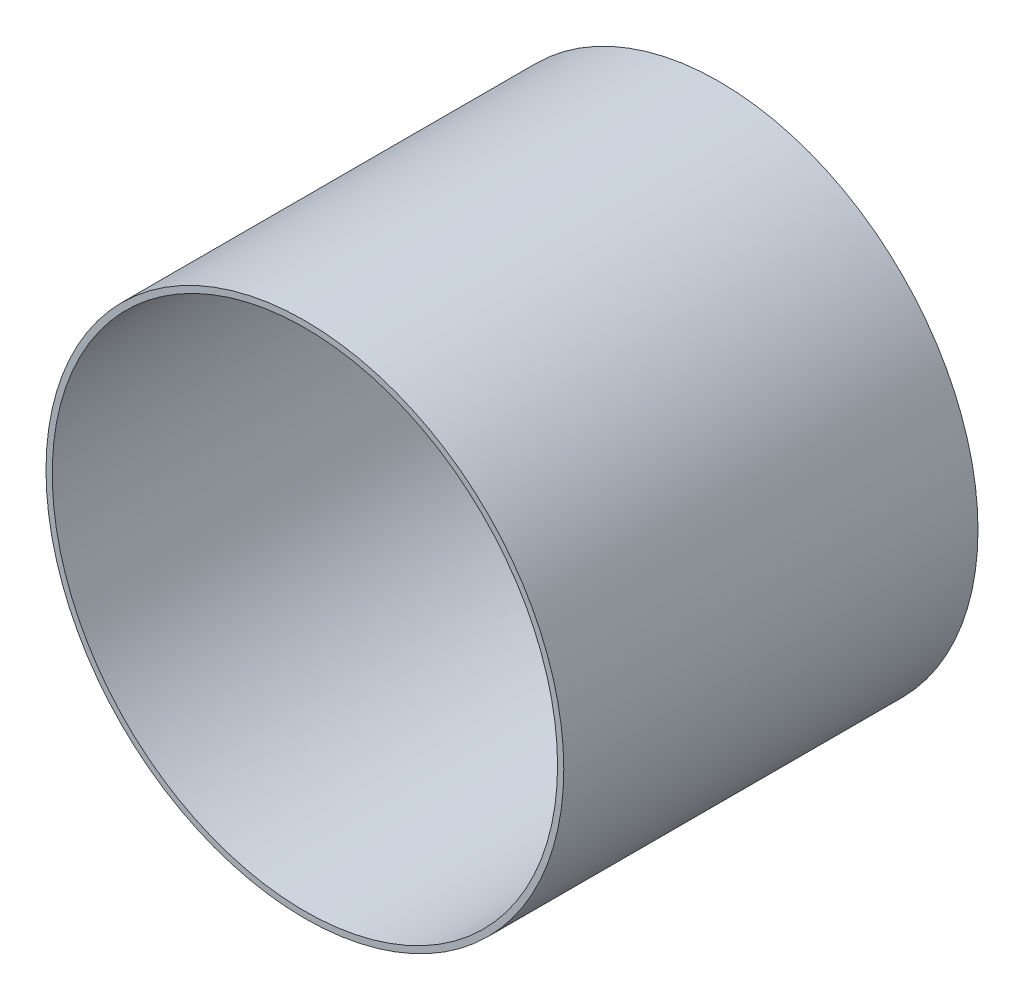
ISO-10303-21;
HEADER;
FILE_DESCRIPTION(('STEP AP214'),'2;1');
FILE_NAME('part.step','',(''),(''),'','','');
FILE_SCHEMA(('AUTOMOTIVE_DESIGN { 1 0 10303 214 1 1 1 1 }'));
ENDSEC;
DATA;
#1=APPLICATION_CONTEXT('core data for automotive mechanical design processes');
#2=APPLICATION_PROTOCOL_DEFINITION('international standard','automotive_design',2000,#1);
#3=PRODUCT_CONTEXT('',#1,'mechanical');
#4=PRODUCT('Part','Part','',(#3));
#5=PRODUCT_RELATED_PRODUCT_CATEGORY('part','',(#4));
#6=PRODUCT_DEFINITION_FORMATION('','',#4);
#7=PRODUCT_DEFINITION_CONTEXT('part definition',#1,'design');
#8=PRODUCT_DEFINITION('design','',#6,#7);
#9=PRODUCT_DEFINITION_SHAPE('','',#8);
#10=(LENGTH_UNIT() NAMED_UNIT(*) SI_UNIT(.MILLI.,.METRE.));
#11=(NAMED_UNIT(*) PLANE_ANGLE_UNIT() SI_UNIT($,.RADIAN.));
#12=(NAMED_UNIT(*) SI_UNIT($,.STERADIAN.) SOLID_ANGLE_UNIT());
#13=UNCERTAINTY_MEASURE_WITH_UNIT(LENGTH_MEASURE(1.E-05),#10,'distance_accuracy_value','');
#14=(GEOMETRIC_REPRESENTATION_CONTEXT(3) GLOBAL_UNCERTAINTY_ASSIGNED_CONTEXT((#13)) GLOBAL_UNIT_ASSIGNED_CONTEXT((#10,
#11,#12)) REPRESENTATION_CONTEXT('',''));
#15=CARTESIAN_POINT('',(0.,0.,0.));
#16=DIRECTION('',(0.,0.,1.));
#17=DIRECTION('',(1.,0.,0.));
#18=AXIS2_PLACEMENT_3D('',#15,#16,#17);
#19=CARTESIAN_POINT('',(-50.6623996863792,7.11146446941415,40.));
#20=DIRECTION('',(0.,0.,1.));
#21=DIRECTION('',(1.,0.,0.));
#22=AXIS2_PLACEMENT_3D('',#19,#20,#21);
#23=PLANE('',#22);
#24=CARTESIAN_POINT('',(-50.6623996863792,7.11146446941415,40.));
#25=DIRECTION('',(0.,0.,1.));
#26=DIRECTION('',(1.,0.,0.));
#27=AXIS2_PLACEMENT_3D('',#24,#25,#26);
#28=CIRCLE('',#27,25.);
#29=CARTESIAN_POINT('',(-25.6623996863792,7.11146446941415,40.));
#30=VERTEX_POINT('',#29);
#31=EDGE_CURVE('E10',#30,#30,#28,.T.);
#32=ORIENTED_EDGE('',*,*,#31,.T.);
#33=EDGE_LOOP('',(#32));
#34=FACE_BOUND('',#33,.T.);
#35=CARTESIAN_POINT('',(-50.6623996863792,7.11146446941415,40.));
#36=DIRECTION('',(0.,0.,1.));
#37=DIRECTION('',(1.,0.,0.));
#38=AXIS2_PLACEMENT_3D('',#35,#36,#37);
#39=CIRCLE('',#38,24.4);
#40=CARTESIAN_POINT('',(-26.2623996863792,7.11146446941415,40.));
#41=VERTEX_POINT('',#40);
#42=EDGE_CURVE('E42',#41,#41,#39,.T.);
#43=ORIENTED_EDGE('',*,*,#42,.F.);
#44=EDGE_LOOP('',(#43));
#45=FACE_BOUND('',#44,.T.);
#46=ADVANCED_FACE('F31',(#34,#45),#23,.T.);
#47=CARTESIAN_POINT('',(-50.6623996863792,7.11146446941415,0.));
#48=DIRECTION('',(0.,0.,1.));
#49=DIRECTION('',(1.,0.,0.));
#50=AXIS2_PLACEMENT_3D('',#47,#48,#49);
#51=PLANE('',#50);
#52=CARTESIAN_POINT('',(-50.6623996863792,7.11146446941415,0.));
#53=DIRECTION('',(0.,0.,1.));
#54=DIRECTION('',(1.,0.,0.));
#55=AXIS2_PLACEMENT_3D('',#52,#53,#54);
#56=CIRCLE('',#55,25.);
#57=CARTESIAN_POINT('',(-25.6623996863792,7.11146446941415,0.));
#58=VERTEX_POINT('',#57);
#59=EDGE_CURVE('E35',#58,#58,#56,.T.);
#60=ORIENTED_EDGE('',*,*,#59,.F.);
#61=EDGE_LOOP('',(#60));
#62=FACE_BOUND('',#61,.T.);
#63=CARTESIAN_POINT('',(-50.6623996863792,7.11146446941415,0.));
#64=DIRECTION('',(0.,0.,1.));
#65=DIRECTION('',(1.,0.,0.));
#66=AXIS2_PLACEMENT_3D('',#63,#64,#65);
#67=CIRCLE('',#66,24.4);
#68=CARTESIAN_POINT('',(-26.2623996863792,7.11146446941415,0.));
#69=VERTEX_POINT('',#68);
#70=EDGE_CURVE('E44',#69,#69,#67,.T.);
#71=ORIENTED_EDGE('',*,*,#70,.T.);
#72=EDGE_LOOP('',(#71));
#73=FACE_BOUND('',#72,.T.);
#74=ADVANCED_FACE('F54',(#62,#73),#51,.F.);
#75=CARTESIAN_POINT('',(-50.6623996863792,7.11146446941415,40.));
#76=DIRECTION('',(0.,0.,-1.));
#77=DIRECTION('',(-1.,0.,0.));
#78=AXIS2_PLACEMENT_3D('',#75,#76,#77);
#79=CYLINDRICAL_SURFACE('',#78,25.);
#80=ORIENTED_EDGE('',*,*,#31,.F.);
#81=EDGE_LOOP('',(#80));
#82=FACE_BOUND('',#81,.T.);
#83=ORIENTED_EDGE('',*,*,#59,.T.);
#84=EDGE_LOOP('',(#83));
#85=FACE_BOUND('',#84,.T.);
#86=ADVANCED_FACE('F33',(#82,#85),#79,.T.);
#87=CARTESIAN_POINT('',(-50.6623996863792,7.11146446941415,40.));
#88=DIRECTION('',(0.,0.,-1.));
#89=DIRECTION('',(-1.,0.,0.));
#90=AXIS2_PLACEMENT_3D('',#87,#88,#89);
#91=CYLINDRICAL_SURFACE('',#90,24.4);
#92=ORIENTED_EDGE('',*,*,#42,.T.);
#93=EDGE_LOOP('',(#92));
#94=FACE_BOUND('',#93,.T.);
#95=ORIENTED_EDGE('',*,*,#70,.F.);
#96=EDGE_LOOP('',(#95));
#97=FACE_BOUND('',#96,.T.);
#98=ADVANCED_FACE('F50',(#94,#97),#91,.F.);
#99=CLOSED_SHELL('',(#46,#74,#86,#98));
#100=MANIFOLD_SOLID_BREP('B2',#99);
#101=ADVANCED_BREP_SHAPE_REPRESENTATION('',(#18,#100),#14);
#102=SHAPE_DEFINITION_REPRESENTATION(#9,#101);
ENDSEC;
END-ISO-10303-21;
